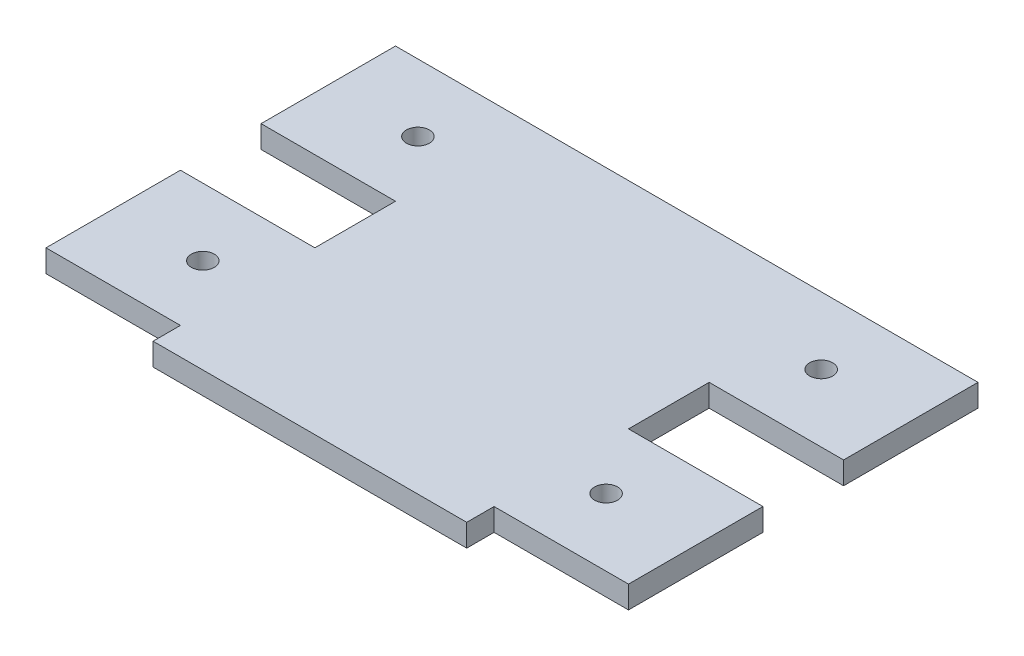
ISO-10303-21;
HEADER;
FILE_DESCRIPTION(('STEP AP214'),'2;1');
FILE_NAME('part.step','',(''),(''),'','','');
FILE_SCHEMA(('AUTOMOTIVE_DESIGN { 1 0 10303 214 1 1 1 1 }'));
ENDSEC;
DATA;
#1=APPLICATION_CONTEXT('core data for automotive mechanical design processes');
#2=APPLICATION_PROTOCOL_DEFINITION('international standard','automotive_design',2000,#1);
#3=PRODUCT_CONTEXT('',#1,'mechanical');
#4=PRODUCT('Part','Part','',(#3));
#5=PRODUCT_RELATED_PRODUCT_CATEGORY('part','',(#4));
#6=PRODUCT_DEFINITION_FORMATION('','',#4);
#7=PRODUCT_DEFINITION_CONTEXT('part definition',#1,'design');
#8=PRODUCT_DEFINITION('design','',#6,#7);
#9=PRODUCT_DEFINITION_SHAPE('','',#8);
#10=(LENGTH_UNIT() NAMED_UNIT(*) SI_UNIT(.MILLI.,.METRE.));
#11=(NAMED_UNIT(*) PLANE_ANGLE_UNIT() SI_UNIT($,.RADIAN.));
#12=(NAMED_UNIT(*) SI_UNIT($,.STERADIAN.) SOLID_ANGLE_UNIT());
#13=UNCERTAINTY_MEASURE_WITH_UNIT(LENGTH_MEASURE(1.E-05),#10,'distance_accuracy_value','');
#14=(GEOMETRIC_REPRESENTATION_CONTEXT(3) GLOBAL_UNCERTAINTY_ASSIGNED_CONTEXT((#13)) GLOBAL_UNIT_ASSIGNED_CONTEXT((#10,
#11,#12)) REPRESENTATION_CONTEXT('',''));
#15=CARTESIAN_POINT('',(0.,0.,0.));
#16=DIRECTION('',(0.,0.,1.));
#17=DIRECTION('',(1.,0.,0.));
#18=AXIS2_PLACEMENT_3D('',#15,#16,#17);
#19=CARTESIAN_POINT('',(0.,0.,0.));
#20=DIRECTION('',(0.,-1.,0.));
#21=DIRECTION('',(0.,0.,-1.));
#22=AXIS2_PLACEMENT_3D('',#19,#20,#21);
#23=PLANE('',#22);
#24=DIRECTION('',(1.,0.,0.));
#25=VECTOR('',#24,1.);
#26=CARTESIAN_POINT('',(52.6846640756631,0.,-6.53682126909372));
#27=LINE('',#26,#25);
#28=CARTESIAN_POINT('',(0.,0.,-6.53682126909372));
#29=VERTEX_POINT('',#28);
#30=CARTESIAN_POINT('',(44.45,0.,-6.53682126909372));
#31=VERTEX_POINT('',#30);
#32=EDGE_CURVE('E324',#29,#31,#27,.T.);
#33=ORIENTED_EDGE('',*,*,#32,.F.);
#34=DIRECTION('',(0.,0.,1.));
#35=VECTOR('',#34,1.);
#36=CARTESIAN_POINT('',(0.,0.,0.));
#37=LINE('',#36,#35);
#38=CARTESIAN_POINT('',(0.,0.,-10.414));
#39=VERTEX_POINT('',#38);
#40=EDGE_CURVE('E176',#39,#29,#37,.T.);
#41=ORIENTED_EDGE('',*,*,#40,.F.);
#42=DIRECTION('',(1.,0.,0.));
#43=VECTOR('',#42,1.);
#44=CARTESIAN_POINT('',(-19.05,0.,-10.414));
#45=LINE('',#44,#43);
#46=CARTESIAN_POINT('',(-19.05,0.,-10.414));
#47=VERTEX_POINT('',#46);
#48=EDGE_CURVE('E107',#47,#39,#45,.T.);
#49=ORIENTED_EDGE('',*,*,#48,.F.);
#50=DIRECTION('',(0.,0.,1.));
#51=VECTOR('',#50,1.);
#52=CARTESIAN_POINT('',(-19.05,0.,-29.464));
#53=LINE('',#52,#51);
#54=CARTESIAN_POINT('',(-19.05,0.,-29.464));
#55=VERTEX_POINT('',#54);
#56=EDGE_CURVE('E204',#55,#47,#53,.T.);
#57=ORIENTED_EDGE('',*,*,#56,.F.);
#58=DIRECTION('',(-1.,0.,0.));
#59=VECTOR('',#58,1.);
#60=CARTESIAN_POINT('',(0.,0.,-29.464));
#61=LINE('',#60,#59);
#62=CARTESIAN_POINT('',(0.,0.,-29.464));
#63=VERTEX_POINT('',#62);
#64=EDGE_CURVE('E164',#63,#55,#61,.T.);
#65=ORIENTED_EDGE('',*,*,#64,.F.);
#66=DIRECTION('',(0.,0.,1.));
#67=VECTOR('',#66,1.);
#68=CARTESIAN_POINT('',(0.,0.,-29.464));
#69=LINE('',#68,#67);
#70=CARTESIAN_POINT('',(0.,0.,-40.894));
#71=VERTEX_POINT('',#70);
#72=EDGE_CURVE('E201',#71,#63,#69,.T.);
#73=ORIENTED_EDGE('',*,*,#72,.F.);
#74=DIRECTION('',(1.,0.,0.));
#75=VECTOR('',#74,1.);
#76=CARTESIAN_POINT('',(0.,0.,-40.894));
#77=LINE('',#76,#75);
#78=CARTESIAN_POINT('',(-19.05,0.,-40.894));
#79=VERTEX_POINT('',#78);
#80=EDGE_CURVE('E199',#79,#71,#77,.T.);
#81=ORIENTED_EDGE('',*,*,#80,.F.);
#82=DIRECTION('',(0.,0.,1.));
#83=VECTOR('',#82,1.);
#84=CARTESIAN_POINT('',(-19.05,0.,-40.894));
#85=LINE('',#84,#83);
#86=CARTESIAN_POINT('',(-19.05,0.,-59.944));
#87=VERTEX_POINT('',#86);
#88=EDGE_CURVE('E197',#87,#79,#85,.T.);
#89=ORIENTED_EDGE('',*,*,#88,.F.);
#90=DIRECTION('',(-1.,0.,0.));
#91=VECTOR('',#90,1.);
#92=CARTESIAN_POINT('',(-19.05,0.,-59.944));
#93=LINE('',#92,#91);
#94=CARTESIAN_POINT('',(63.5000000000001,0.,-59.944));
#95=VERTEX_POINT('',#94);
#96=EDGE_CURVE('E195',#95,#87,#93,.T.);
#97=ORIENTED_EDGE('',*,*,#96,.F.);
#98=DIRECTION('',(0.,0.,-1.));
#99=VECTOR('',#98,1.);
#100=CARTESIAN_POINT('',(63.5000000000001,0.,-59.944));
#101=LINE('',#100,#99);
#102=CARTESIAN_POINT('',(63.5,0.,-40.894));
#103=VERTEX_POINT('',#102);
#104=EDGE_CURVE('E192',#103,#95,#101,.T.);
#105=ORIENTED_EDGE('',*,*,#104,.F.);
#106=DIRECTION('',(1.,0.,0.));
#107=VECTOR('',#106,1.);
#108=CARTESIAN_POINT('',(63.5,0.,-40.894));
#109=LINE('',#108,#107);
#110=CARTESIAN_POINT('',(44.4500000000001,0.,-40.894));
#111=VERTEX_POINT('',#110);
#112=EDGE_CURVE('E190',#111,#103,#109,.T.);
#113=ORIENTED_EDGE('',*,*,#112,.F.);
#114=DIRECTION('',(0.,0.,-1.));
#115=VECTOR('',#114,1.);
#116=CARTESIAN_POINT('',(44.4500000000001,0.,-40.894));
#117=LINE('',#116,#115);
#118=CARTESIAN_POINT('',(44.4500000000001,0.,-29.464));
#119=VERTEX_POINT('',#118);
#120=EDGE_CURVE('E188',#119,#111,#117,.T.);
#121=ORIENTED_EDGE('',*,*,#120,.F.);
#122=DIRECTION('',(-1.,0.,0.));
#123=VECTOR('',#122,1.);
#124=CARTESIAN_POINT('',(44.4500000000001,0.,-29.464));
#125=LINE('',#124,#123);
#126=CARTESIAN_POINT('',(63.5,0.,-29.464));
#127=VERTEX_POINT('',#126);
#128=EDGE_CURVE('E186',#127,#119,#125,.T.);
#129=ORIENTED_EDGE('',*,*,#128,.F.);
#130=DIRECTION('',(0.,0.,-1.));
#131=VECTOR('',#130,1.);
#132=CARTESIAN_POINT('',(63.5,0.,-29.464));
#133=LINE('',#132,#131);
#134=CARTESIAN_POINT('',(63.5,0.,-10.414));
#135=VERTEX_POINT('',#134);
#136=EDGE_CURVE('E184',#135,#127,#133,.T.);
#137=ORIENTED_EDGE('',*,*,#136,.F.);
#138=DIRECTION('',(1.,0.,0.));
#139=VECTOR('',#138,1.);
#140=CARTESIAN_POINT('',(63.5,0.,-10.414));
#141=LINE('',#140,#139);
#142=CARTESIAN_POINT('',(44.4500000000001,0.,-10.414));
#143=VERTEX_POINT('',#142);
#144=EDGE_CURVE('E182',#143,#135,#141,.T.);
#145=ORIENTED_EDGE('',*,*,#144,.F.);
#146=DIRECTION('',(0.,0.,-1.));
#147=VECTOR('',#146,1.);
#148=CARTESIAN_POINT('',(44.45,0.,0.));
#149=LINE('',#148,#147);
#150=EDGE_CURVE('E179',#31,#143,#149,.T.);
#151=ORIENTED_EDGE('',*,*,#150,.F.);
#152=EDGE_LOOP('',(#33,#41,#49,#57,#65,#73,#81,#89,#97,#105,#113,#121,#129,#137,#145,#151));
#153=FACE_BOUND('',#152,.T.);
#154=CARTESIAN_POINT('',(-6.35,0.,-50.4189999999999));
#155=DIRECTION('',(0.,1.,0.));
#156=DIRECTION('',(0.,0.,1.));
#157=AXIS2_PLACEMENT_3D('',#154,#155,#156);
#158=CIRCLE('',#157,1.63195);
#159=CARTESIAN_POINT('',(-6.35,0.,-48.78705));
#160=VERTEX_POINT('',#159);
#161=EDGE_CURVE('E316',#160,#160,#158,.T.);
#162=ORIENTED_EDGE('',*,*,#161,.T.);
#163=EDGE_LOOP('',(#162));
#164=FACE_BOUND('',#163,.T.);
#165=CARTESIAN_POINT('',(50.8000000000001,0.,-50.419));
#166=DIRECTION('',(0.,1.,0.));
#167=DIRECTION('',(0.,0.,1.));
#168=AXIS2_PLACEMENT_3D('',#165,#166,#167);
#169=CIRCLE('',#168,1.63195);
#170=CARTESIAN_POINT('',(50.8000000000001,0.,-48.78705));
#171=VERTEX_POINT('',#170);
#172=EDGE_CURVE('E310',#171,#171,#169,.T.);
#173=ORIENTED_EDGE('',*,*,#172,.T.);
#174=EDGE_LOOP('',(#173));
#175=FACE_BOUND('',#174,.T.);
#176=CARTESIAN_POINT('',(50.8,0.,-19.939));
#177=DIRECTION('',(0.,1.,0.));
#178=DIRECTION('',(0.,0.,1.));
#179=AXIS2_PLACEMENT_3D('',#176,#177,#178);
#180=CIRCLE('',#179,1.63195);
#181=CARTESIAN_POINT('',(50.8,0.,-18.30705));
#182=VERTEX_POINT('',#181);
#183=EDGE_CURVE('E304',#182,#182,#180,.T.);
#184=ORIENTED_EDGE('',*,*,#183,.T.);
#185=EDGE_LOOP('',(#184));
#186=FACE_BOUND('',#185,.T.);
#187=CARTESIAN_POINT('',(-6.35,0.,-19.939));
#188=DIRECTION('',(0.,1.,0.));
#189=DIRECTION('',(0.,0.,1.));
#190=AXIS2_PLACEMENT_3D('',#187,#188,#189);
#191=CIRCLE('',#190,1.63195);
#192=CARTESIAN_POINT('',(-6.35,0.,-18.30705));
#193=VERTEX_POINT('',#192);
#194=EDGE_CURVE('E180',#193,#193,#191,.T.);
#195=ORIENTED_EDGE('',*,*,#194,.T.);
#196=EDGE_LOOP('',(#195));
#197=FACE_BOUND('',#196,.T.);
#198=ADVANCED_FACE('F33',(#153,#164,#175,#186,#197),#23,.T.);
#199=CARTESIAN_POINT('',(0.,3.175,0.));
#200=DIRECTION('',(1.,0.,0.));
#201=DIRECTION('',(0.,0.,-1.));
#202=AXIS2_PLACEMENT_3D('',#199,#200,#201);
#203=PLANE('',#202);
#204=ORIENTED_EDGE('',*,*,#40,.T.);
#205=DIRECTION('',(0.,1.,0.));
#206=VECTOR('',#205,1.);
#207=CARTESIAN_POINT('',(0.,3.175,-6.53682126909372));
#208=LINE('',#207,#206);
#209=CARTESIAN_POINT('',(0.,3.175,-6.53682126909372));
#210=VERTEX_POINT('',#209);
#211=EDGE_CURVE('E295',#29,#210,#208,.T.);
#212=ORIENTED_EDGE('',*,*,#211,.T.);
#213=DIRECTION('',(0.,0.,1.));
#214=VECTOR('',#213,1.);
#215=CARTESIAN_POINT('',(0.,3.175,0.));
#216=LINE('',#215,#214);
#217=CARTESIAN_POINT('',(0.,3.175,-10.414));
#218=VERTEX_POINT('',#217);
#219=EDGE_CURVE('E207',#218,#210,#216,.T.);
#220=ORIENTED_EDGE('',*,*,#219,.F.);
#221=DIRECTION('',(0.,-1.,0.));
#222=VECTOR('',#221,1.);
#223=CARTESIAN_POINT('',(0.,3.175,-10.414));
#224=LINE('',#223,#222);
#225=EDGE_CURVE('E172',#218,#39,#224,.T.);
#226=ORIENTED_EDGE('',*,*,#225,.T.);
#227=EDGE_LOOP('',(#204,#212,#220,#226));
#228=FACE_BOUND('',#227,.T.);
#229=ADVANCED_FACE('F35',(#228),#203,.F.);
#230=CARTESIAN_POINT('',(44.45,3.175,0.));
#231=DIRECTION('',(-1.,0.,0.));
#232=DIRECTION('',(0.,0.,1.));
#233=AXIS2_PLACEMENT_3D('',#230,#231,#232);
#234=PLANE('',#233);
#235=DIRECTION('',(0.,0.,-1.));
#236=VECTOR('',#235,1.);
#237=CARTESIAN_POINT('',(44.45,3.175,0.));
#238=LINE('',#237,#236);
#239=CARTESIAN_POINT('',(44.4500000000001,3.175,-6.53682126909372));
#240=VERTEX_POINT('',#239);
#241=CARTESIAN_POINT('',(44.4500000000001,3.175,-10.414));
#242=VERTEX_POINT('',#241);
#243=EDGE_CURVE('E114',#240,#242,#238,.T.);
#244=ORIENTED_EDGE('',*,*,#243,.F.);
#245=DIRECTION('',(0.,-1.,0.));
#246=VECTOR('',#245,1.);
#247=CARTESIAN_POINT('',(44.4500000000001,3.175,-6.53682126909372));
#248=LINE('',#247,#246);
#249=EDGE_CURVE('E48',#240,#31,#248,.T.);
#250=ORIENTED_EDGE('',*,*,#249,.T.);
#251=ORIENTED_EDGE('',*,*,#150,.T.);
#252=DIRECTION('',(0.,-1.,0.));
#253=VECTOR('',#252,1.);
#254=CARTESIAN_POINT('',(44.4500000000001,3.175,-10.414));
#255=LINE('',#254,#253);
#256=EDGE_CURVE('E41',#242,#143,#255,.T.);
#257=ORIENTED_EDGE('',*,*,#256,.F.);
#258=EDGE_LOOP('',(#244,#250,#251,#257));
#259=FACE_BOUND('',#258,.T.);
#260=ADVANCED_FACE('F327',(#259),#234,.F.);
#261=CARTESIAN_POINT('',(63.5,3.175,-10.414));
#262=DIRECTION('',(0.,0.,-1.));
#263=DIRECTION('',(-1.,0.,0.));
#264=AXIS2_PLACEMENT_3D('',#261,#262,#263);
#265=PLANE('',#264);
#266=ORIENTED_EDGE('',*,*,#144,.T.);
#267=DIRECTION('',(0.,-1.,0.));
#268=VECTOR('',#267,1.);
#269=CARTESIAN_POINT('',(63.5,3.175,-10.414));
#270=LINE('',#269,#268);
#271=CARTESIAN_POINT('',(63.5,3.175,-10.414));
#272=VERTEX_POINT('',#271);
#273=EDGE_CURVE('E235',#272,#135,#270,.T.);
#274=ORIENTED_EDGE('',*,*,#273,.F.);
#275=DIRECTION('',(1.,0.,0.));
#276=VECTOR('',#275,1.);
#277=CARTESIAN_POINT('',(63.5,3.175,-10.414));
#278=LINE('',#277,#276);
#279=EDGE_CURVE('E243',#242,#272,#278,.T.);
#280=ORIENTED_EDGE('',*,*,#279,.F.);
#281=ORIENTED_EDGE('',*,*,#256,.T.);
#282=EDGE_LOOP('',(#266,#274,#280,#281));
#283=FACE_BOUND('',#282,.T.);
#284=ADVANCED_FACE('F241',(#283),#265,.F.);
#285=CARTESIAN_POINT('',(63.5,3.175,-29.464));
#286=DIRECTION('',(-1.,0.,0.));
#287=DIRECTION('',(0.,0.,1.));
#288=AXIS2_PLACEMENT_3D('',#285,#286,#287);
#289=PLANE('',#288);
#290=ORIENTED_EDGE('',*,*,#136,.T.);
#291=DIRECTION('',(0.,-1.,0.));
#292=VECTOR('',#291,1.);
#293=CARTESIAN_POINT('',(63.5,3.175,-29.464));
#294=LINE('',#293,#292);
#295=CARTESIAN_POINT('',(63.5,3.175,-29.464));
#296=VERTEX_POINT('',#295);
#297=EDGE_CURVE('E232',#296,#127,#294,.T.);
#298=ORIENTED_EDGE('',*,*,#297,.F.);
#299=DIRECTION('',(0.,0.,-1.));
#300=VECTOR('',#299,1.);
#301=CARTESIAN_POINT('',(63.5,3.175,-29.464));
#302=LINE('',#301,#300);
#303=EDGE_CURVE('E264',#272,#296,#302,.T.);
#304=ORIENTED_EDGE('',*,*,#303,.F.);
#305=ORIENTED_EDGE('',*,*,#273,.T.);
#306=EDGE_LOOP('',(#290,#298,#304,#305));
#307=FACE_BOUND('',#306,.T.);
#308=ADVANCED_FACE('F255',(#307),#289,.F.);
#309=CARTESIAN_POINT('',(44.4500000000001,3.175,-29.464));
#310=DIRECTION('',(0.,0.,1.));
#311=DIRECTION('',(1.,0.,0.));
#312=AXIS2_PLACEMENT_3D('',#309,#310,#311);
#313=PLANE('',#312);
#314=ORIENTED_EDGE('',*,*,#128,.T.);
#315=DIRECTION('',(0.,-1.,0.));
#316=VECTOR('',#315,1.);
#317=CARTESIAN_POINT('',(44.4500000000001,3.175,-29.464));
#318=LINE('',#317,#316);
#319=CARTESIAN_POINT('',(44.4500000000001,3.175,-29.464));
#320=VERTEX_POINT('',#319);
#321=EDGE_CURVE('E229',#320,#119,#318,.T.);
#322=ORIENTED_EDGE('',*,*,#321,.F.);
#323=DIRECTION('',(-1.,0.,0.));
#324=VECTOR('',#323,1.);
#325=CARTESIAN_POINT('',(44.4500000000001,3.175,-29.464));
#326=LINE('',#325,#324);
#327=EDGE_CURVE('E261',#296,#320,#326,.T.);
#328=ORIENTED_EDGE('',*,*,#327,.F.);
#329=ORIENTED_EDGE('',*,*,#297,.T.);
#330=EDGE_LOOP('',(#314,#322,#328,#329));
#331=FACE_BOUND('',#330,.T.);
#332=ADVANCED_FACE('F259',(#331),#313,.F.);
#333=CARTESIAN_POINT('',(44.4500000000001,3.175,-40.894));
#334=DIRECTION('',(-1.,0.,0.));
#335=DIRECTION('',(0.,0.,1.));
#336=AXIS2_PLACEMENT_3D('',#333,#334,#335);
#337=PLANE('',#336);
#338=ORIENTED_EDGE('',*,*,#120,.T.);
#339=DIRECTION('',(0.,-1.,0.));
#340=VECTOR('',#339,1.);
#341=CARTESIAN_POINT('',(44.4500000000001,3.175,-40.894));
#342=LINE('',#341,#340);
#343=CARTESIAN_POINT('',(44.4500000000001,3.175,-40.894));
#344=VERTEX_POINT('',#343);
#345=EDGE_CURVE('E226',#344,#111,#342,.T.);
#346=ORIENTED_EDGE('',*,*,#345,.F.);
#347=DIRECTION('',(0.,0.,-1.));
#348=VECTOR('',#347,1.);
#349=CARTESIAN_POINT('',(44.4500000000001,3.175,-40.894));
#350=LINE('',#349,#348);
#351=EDGE_CURVE('E263',#320,#344,#350,.T.);
#352=ORIENTED_EDGE('',*,*,#351,.F.);
#353=ORIENTED_EDGE('',*,*,#321,.T.);
#354=EDGE_LOOP('',(#338,#346,#352,#353));
#355=FACE_BOUND('',#354,.T.);
#356=ADVANCED_FACE('F366',(#355),#337,.F.);
#357=CARTESIAN_POINT('',(63.5,3.175,-40.894));
#358=DIRECTION('',(0.,0.,-1.));
#359=DIRECTION('',(-1.,0.,0.));
#360=AXIS2_PLACEMENT_3D('',#357,#358,#359);
#361=PLANE('',#360);
#362=ORIENTED_EDGE('',*,*,#112,.T.);
#363=DIRECTION('',(0.,-1.,0.));
#364=VECTOR('',#363,1.);
#365=CARTESIAN_POINT('',(63.5,3.175,-40.894));
#366=LINE('',#365,#364);
#367=CARTESIAN_POINT('',(63.5,3.175,-40.894));
#368=VERTEX_POINT('',#367);
#369=EDGE_CURVE('E223',#368,#103,#366,.T.);
#370=ORIENTED_EDGE('',*,*,#369,.F.);
#371=DIRECTION('',(1.,0.,0.));
#372=VECTOR('',#371,1.);
#373=CARTESIAN_POINT('',(63.5,3.175,-40.894));
#374=LINE('',#373,#372);
#375=EDGE_CURVE('E266',#344,#368,#374,.T.);
#376=ORIENTED_EDGE('',*,*,#375,.F.);
#377=ORIENTED_EDGE('',*,*,#345,.T.);
#378=EDGE_LOOP('',(#362,#370,#376,#377));
#379=FACE_BOUND('',#378,.T.);
#380=ADVANCED_FACE('F362',(#379),#361,.F.);
#381=CARTESIAN_POINT('',(63.5000000000001,3.175,-59.944));
#382=DIRECTION('',(-1.,0.,0.));
#383=DIRECTION('',(0.,0.,1.));
#384=AXIS2_PLACEMENT_3D('',#381,#382,#383);
#385=PLANE('',#384);
#386=ORIENTED_EDGE('',*,*,#104,.T.);
#387=DIRECTION('',(0.,-1.,0.));
#388=VECTOR('',#387,1.);
#389=CARTESIAN_POINT('',(63.5000000000001,3.175,-59.944));
#390=LINE('',#389,#388);
#391=CARTESIAN_POINT('',(63.5000000000001,3.175,-59.944));
#392=VERTEX_POINT('',#391);
#393=EDGE_CURVE('E220',#392,#95,#390,.T.);
#394=ORIENTED_EDGE('',*,*,#393,.F.);
#395=DIRECTION('',(0.,0.,-1.));
#396=VECTOR('',#395,1.);
#397=CARTESIAN_POINT('',(63.5000000000001,3.175,-59.944));
#398=LINE('',#397,#396);
#399=EDGE_CURVE('E272',#368,#392,#398,.T.);
#400=ORIENTED_EDGE('',*,*,#399,.F.);
#401=ORIENTED_EDGE('',*,*,#369,.T.);
#402=EDGE_LOOP('',(#386,#394,#400,#401));
#403=FACE_BOUND('',#402,.T.);
#404=ADVANCED_FACE('F358',(#403),#385,.F.);
#405=CARTESIAN_POINT('',(-19.05,3.175,-59.944));
#406=DIRECTION('',(0.,0.,1.));
#407=DIRECTION('',(1.,0.,0.));
#408=AXIS2_PLACEMENT_3D('',#405,#406,#407);
#409=PLANE('',#408);
#410=DIRECTION('',(0.,-1.,0.));
#411=VECTOR('',#410,1.);
#412=CARTESIAN_POINT('',(-19.05,3.175,-59.944));
#413=LINE('',#412,#411);
#414=CARTESIAN_POINT('',(-19.05,3.175,-59.944));
#415=VERTEX_POINT('',#414);
#416=EDGE_CURVE('E217',#415,#87,#413,.T.);
#417=ORIENTED_EDGE('',*,*,#416,.F.);
#418=DIRECTION('',(-1.,0.,0.));
#419=VECTOR('',#418,1.);
#420=CARTESIAN_POINT('',(44.4500000000001,3.175,-59.944));
#421=LINE('',#420,#419);
#422=EDGE_CURVE('E274',#392,#415,#421,.T.);
#423=ORIENTED_EDGE('',*,*,#422,.F.);
#424=ORIENTED_EDGE('',*,*,#393,.T.);
#425=ORIENTED_EDGE('',*,*,#96,.T.);
#426=EDGE_LOOP('',(#417,#423,#424,#425));
#427=FACE_BOUND('',#426,.T.);
#428=ADVANCED_FACE('F354',(#427),#409,.F.);
#429=CARTESIAN_POINT('',(-19.05,3.175,-40.894));
#430=DIRECTION('',(1.,0.,0.));
#431=DIRECTION('',(0.,0.,-1.));
#432=AXIS2_PLACEMENT_3D('',#429,#430,#431);
#433=PLANE('',#432);
#434=ORIENTED_EDGE('',*,*,#88,.T.);
#435=DIRECTION('',(0.,-1.,0.));
#436=VECTOR('',#435,1.);
#437=CARTESIAN_POINT('',(-19.05,3.175,-40.894));
#438=LINE('',#437,#436);
#439=CARTESIAN_POINT('',(-19.05,3.175,-40.894));
#440=VERTEX_POINT('',#439);
#441=EDGE_CURVE('E214',#440,#79,#438,.T.);
#442=ORIENTED_EDGE('',*,*,#441,.F.);
#443=DIRECTION('',(0.,0.,1.));
#444=VECTOR('',#443,1.);
#445=CARTESIAN_POINT('',(-19.05,3.175,-40.894));
#446=LINE('',#445,#444);
#447=EDGE_CURVE('E276',#415,#440,#446,.T.);
#448=ORIENTED_EDGE('',*,*,#447,.F.);
#449=ORIENTED_EDGE('',*,*,#416,.T.);
#450=EDGE_LOOP('',(#434,#442,#448,#449));
#451=FACE_BOUND('',#450,.T.);
#452=ADVANCED_FACE('F351',(#451),#433,.F.);
#453=CARTESIAN_POINT('',(0.,3.175,-40.894));
#454=DIRECTION('',(0.,0.,-1.));
#455=DIRECTION('',(-1.,0.,0.));
#456=AXIS2_PLACEMENT_3D('',#453,#454,#455);
#457=PLANE('',#456);
#458=ORIENTED_EDGE('',*,*,#80,.T.);
#459=DIRECTION('',(0.,-1.,0.));
#460=VECTOR('',#459,1.);
#461=CARTESIAN_POINT('',(0.,3.175,-40.894));
#462=LINE('',#461,#460);
#463=CARTESIAN_POINT('',(0.,3.175,-40.894));
#464=VERTEX_POINT('',#463);
#465=EDGE_CURVE('E211',#464,#71,#462,.T.);
#466=ORIENTED_EDGE('',*,*,#465,.F.);
#467=DIRECTION('',(1.,0.,0.));
#468=VECTOR('',#467,1.);
#469=CARTESIAN_POINT('',(0.,3.175,-40.894));
#470=LINE('',#469,#468);
#471=EDGE_CURVE('E278',#440,#464,#470,.T.);
#472=ORIENTED_EDGE('',*,*,#471,.F.);
#473=ORIENTED_EDGE('',*,*,#441,.T.);
#474=EDGE_LOOP('',(#458,#466,#472,#473));
#475=FACE_BOUND('',#474,.T.);
#476=ADVANCED_FACE('F284',(#475),#457,.F.);
#477=CARTESIAN_POINT('',(0.,3.175,-29.464));
#478=DIRECTION('',(1.,0.,0.));
#479=DIRECTION('',(0.,0.,-1.));
#480=AXIS2_PLACEMENT_3D('',#477,#478,#479);
#481=PLANE('',#480);
#482=ORIENTED_EDGE('',*,*,#72,.T.);
#483=DIRECTION('',(0.,-1.,0.));
#484=VECTOR('',#483,1.);
#485=CARTESIAN_POINT('',(0.,3.175,-29.464));
#486=LINE('',#485,#484);
#487=CARTESIAN_POINT('',(0.,3.175,-29.464));
#488=VERTEX_POINT('',#487);
#489=EDGE_CURVE('E167',#488,#63,#486,.T.);
#490=ORIENTED_EDGE('',*,*,#489,.F.);
#491=DIRECTION('',(0.,0.,1.));
#492=VECTOR('',#491,1.);
#493=CARTESIAN_POINT('',(0.,3.175,-29.464));
#494=LINE('',#493,#492);
#495=EDGE_CURVE('E155',#464,#488,#494,.T.);
#496=ORIENTED_EDGE('',*,*,#495,.F.);
#497=ORIENTED_EDGE('',*,*,#465,.T.);
#498=EDGE_LOOP('',(#482,#490,#496,#497));
#499=FACE_BOUND('',#498,.T.);
#500=ADVANCED_FACE('F288',(#499),#481,.F.);
#501=CARTESIAN_POINT('',(0.,3.175,-29.464));
#502=DIRECTION('',(0.,0.,1.));
#503=DIRECTION('',(1.,0.,0.));
#504=AXIS2_PLACEMENT_3D('',#501,#502,#503);
#505=PLANE('',#504);
#506=ORIENTED_EDGE('',*,*,#64,.T.);
#507=DIRECTION('',(0.,-1.,0.));
#508=VECTOR('',#507,1.);
#509=CARTESIAN_POINT('',(-19.05,3.175,-29.464));
#510=LINE('',#509,#508);
#511=CARTESIAN_POINT('',(-19.05,3.175,-29.464));
#512=VERTEX_POINT('',#511);
#513=EDGE_CURVE('E161',#512,#55,#510,.T.);
#514=ORIENTED_EDGE('',*,*,#513,.F.);
#515=DIRECTION('',(-1.,0.,0.));
#516=VECTOR('',#515,1.);
#517=CARTESIAN_POINT('',(0.,3.175,-29.464));
#518=LINE('',#517,#516);
#519=EDGE_CURVE('E148',#488,#512,#518,.T.);
#520=ORIENTED_EDGE('',*,*,#519,.F.);
#521=ORIENTED_EDGE('',*,*,#489,.T.);
#522=EDGE_LOOP('',(#506,#514,#520,#521));
#523=FACE_BOUND('',#522,.T.);
#524=ADVANCED_FACE('F162',(#523),#505,.F.);
#525=CARTESIAN_POINT('',(-19.05,3.175,-29.464));
#526=DIRECTION('',(1.,0.,0.));
#527=DIRECTION('',(0.,0.,-1.));
#528=AXIS2_PLACEMENT_3D('',#525,#526,#527);
#529=PLANE('',#528);
#530=ORIENTED_EDGE('',*,*,#56,.T.);
#531=DIRECTION('',(0.,-1.,0.));
#532=VECTOR('',#531,1.);
#533=CARTESIAN_POINT('',(-19.05,3.175,-10.414));
#534=LINE('',#533,#532);
#535=CARTESIAN_POINT('',(-19.05,3.175,-10.414));
#536=VERTEX_POINT('',#535);
#537=EDGE_CURVE('E168',#536,#47,#534,.T.);
#538=ORIENTED_EDGE('',*,*,#537,.F.);
#539=DIRECTION('',(0.,0.,1.));
#540=VECTOR('',#539,1.);
#541=CARTESIAN_POINT('',(-19.05,3.175,-29.464));
#542=LINE('',#541,#540);
#543=EDGE_CURVE('E152',#512,#536,#542,.T.);
#544=ORIENTED_EDGE('',*,*,#543,.F.);
#545=ORIENTED_EDGE('',*,*,#513,.T.);
#546=EDGE_LOOP('',(#530,#538,#544,#545));
#547=FACE_BOUND('',#546,.T.);
#548=ADVANCED_FACE('F170',(#547),#529,.F.);
#549=CARTESIAN_POINT('',(-19.05,3.175,-10.414));
#550=DIRECTION('',(0.,0.,-1.));
#551=DIRECTION('',(-1.,0.,0.));
#552=AXIS2_PLACEMENT_3D('',#549,#550,#551);
#553=PLANE('',#552);
#554=ORIENTED_EDGE('',*,*,#48,.T.);
#555=ORIENTED_EDGE('',*,*,#225,.F.);
#556=DIRECTION('',(1.,0.,0.));
#557=VECTOR('',#556,1.);
#558=CARTESIAN_POINT('',(-19.05,3.175,-10.414));
#559=LINE('',#558,#557);
#560=EDGE_CURVE('E56',#536,#218,#559,.T.);
#561=ORIENTED_EDGE('',*,*,#560,.F.);
#562=ORIENTED_EDGE('',*,*,#537,.T.);
#563=EDGE_LOOP('',(#554,#555,#561,#562));
#564=FACE_BOUND('',#563,.T.);
#565=ADVANCED_FACE('F290',(#564),#553,.F.);
#566=CARTESIAN_POINT('',(0.,3.175,0.));
#567=DIRECTION('',(0.,-1.,0.));
#568=DIRECTION('',(0.,0.,-1.));
#569=AXIS2_PLACEMENT_3D('',#566,#567,#568);
#570=PLANE('',#569);
#571=CARTESIAN_POINT('',(-6.35,3.175,-50.4189999999999));
#572=DIRECTION('',(0.,1.,0.));
#573=DIRECTION('',(0.,0.,1.));
#574=AXIS2_PLACEMENT_3D('',#571,#572,#573);
#575=CIRCLE('',#574,1.63195);
#576=CARTESIAN_POINT('',(-6.35,3.175,-48.78705));
#577=VERTEX_POINT('',#576);
#578=EDGE_CURVE('E319',#577,#577,#575,.T.);
#579=ORIENTED_EDGE('',*,*,#578,.F.);
#580=EDGE_LOOP('',(#579));
#581=FACE_BOUND('',#580,.T.);
#582=CARTESIAN_POINT('',(50.8000000000001,3.175,-50.419));
#583=DIRECTION('',(0.,1.,0.));
#584=DIRECTION('',(0.,0.,1.));
#585=AXIS2_PLACEMENT_3D('',#582,#583,#584);
#586=CIRCLE('',#585,1.63195);
#587=CARTESIAN_POINT('',(50.8000000000001,3.175,-48.78705));
#588=VERTEX_POINT('',#587);
#589=EDGE_CURVE('E313',#588,#588,#586,.T.);
#590=ORIENTED_EDGE('',*,*,#589,.F.);
#591=EDGE_LOOP('',(#590));
#592=FACE_BOUND('',#591,.T.);
#593=CARTESIAN_POINT('',(50.8,3.175,-19.939));
#594=DIRECTION('',(0.,1.,0.));
#595=DIRECTION('',(0.,0.,1.));
#596=AXIS2_PLACEMENT_3D('',#593,#594,#595);
#597=CIRCLE('',#596,1.63195);
#598=CARTESIAN_POINT('',(50.8,3.175,-18.30705));
#599=VERTEX_POINT('',#598);
#600=EDGE_CURVE('E307',#599,#599,#597,.T.);
#601=ORIENTED_EDGE('',*,*,#600,.F.);
#602=EDGE_LOOP('',(#601));
#603=FACE_BOUND('',#602,.T.);
#604=CARTESIAN_POINT('',(-6.35,3.175,-19.939));
#605=DIRECTION('',(0.,1.,0.));
#606=DIRECTION('',(0.,0.,1.));
#607=AXIS2_PLACEMENT_3D('',#604,#605,#606);
#608=CIRCLE('',#607,1.63195);
#609=CARTESIAN_POINT('',(-6.35,3.175,-18.30705));
#610=VERTEX_POINT('',#609);
#611=EDGE_CURVE('E301',#610,#610,#608,.T.);
#612=ORIENTED_EDGE('',*,*,#611,.F.);
#613=EDGE_LOOP('',(#612));
#614=FACE_BOUND('',#613,.T.);
#615=ORIENTED_EDGE('',*,*,#219,.T.);
#616=DIRECTION('',(1.,0.,0.));
#617=VECTOR('',#616,1.);
#618=CARTESIAN_POINT('',(0.,3.175,-6.53682126909372));
#619=LINE('',#618,#617);
#620=EDGE_CURVE('E11',#210,#240,#619,.T.);
#621=ORIENTED_EDGE('',*,*,#620,.T.);
#622=ORIENTED_EDGE('',*,*,#243,.T.);
#623=ORIENTED_EDGE('',*,*,#279,.T.);
#624=ORIENTED_EDGE('',*,*,#303,.T.);
#625=ORIENTED_EDGE('',*,*,#327,.T.);
#626=ORIENTED_EDGE('',*,*,#351,.T.);
#627=ORIENTED_EDGE('',*,*,#375,.T.);
#628=ORIENTED_EDGE('',*,*,#399,.T.);
#629=ORIENTED_EDGE('',*,*,#422,.T.);
#630=ORIENTED_EDGE('',*,*,#447,.T.);
#631=ORIENTED_EDGE('',*,*,#471,.T.);
#632=ORIENTED_EDGE('',*,*,#495,.T.);
#633=ORIENTED_EDGE('',*,*,#519,.T.);
#634=ORIENTED_EDGE('',*,*,#543,.T.);
#635=ORIENTED_EDGE('',*,*,#560,.T.);
#636=EDGE_LOOP('',(#615,#621,#622,#623,#624,#625,#626,#627,#628,#629,#630,#631,#632,#633,#634,#635));
#637=FACE_BOUND('',#636,.T.);
#638=ADVANCED_FACE('F150',(#581,#592,#603,#614,#637),#570,.F.);
#639=CARTESIAN_POINT('',(-6.35,3.175,-19.939));
#640=DIRECTION('',(0.,1.,0.));
#641=DIRECTION('',(0.,0.,1.));
#642=AXIS2_PLACEMENT_3D('',#639,#640,#641);
#643=CYLINDRICAL_SURFACE('',#642,1.63195);
#644=ORIENTED_EDGE('',*,*,#194,.F.);
#645=EDGE_LOOP('',(#644));
#646=FACE_BOUND('',#645,.T.);
#647=ORIENTED_EDGE('',*,*,#611,.T.);
#648=EDGE_LOOP('',(#647));
#649=FACE_BOUND('',#648,.T.);
#650=ADVANCED_FACE('F430',(#646,#649),#643,.F.);
#651=CARTESIAN_POINT('',(50.8,3.175,-19.939));
#652=DIRECTION('',(0.,1.,0.));
#653=DIRECTION('',(0.,0.,1.));
#654=AXIS2_PLACEMENT_3D('',#651,#652,#653);
#655=CYLINDRICAL_SURFACE('',#654,1.63195);
#656=ORIENTED_EDGE('',*,*,#183,.F.);
#657=EDGE_LOOP('',(#656));
#658=FACE_BOUND('',#657,.T.);
#659=ORIENTED_EDGE('',*,*,#600,.T.);
#660=EDGE_LOOP('',(#659));
#661=FACE_BOUND('',#660,.T.);
#662=ADVANCED_FACE('F437',(#658,#661),#655,.F.);
#663=CARTESIAN_POINT('',(50.8000000000001,3.175,-50.419));
#664=DIRECTION('',(0.,1.,0.));
#665=DIRECTION('',(0.,0.,1.));
#666=AXIS2_PLACEMENT_3D('',#663,#664,#665);
#667=CYLINDRICAL_SURFACE('',#666,1.63195);
#668=ORIENTED_EDGE('',*,*,#172,.F.);
#669=EDGE_LOOP('',(#668));
#670=FACE_BOUND('',#669,.T.);
#671=ORIENTED_EDGE('',*,*,#589,.T.);
#672=EDGE_LOOP('',(#671));
#673=FACE_BOUND('',#672,.T.);
#674=ADVANCED_FACE('F444',(#670,#673),#667,.F.);
#675=CARTESIAN_POINT('',(-6.35,3.175,-50.4189999999999));
#676=DIRECTION('',(0.,1.,0.));
#677=DIRECTION('',(0.,0.,1.));
#678=AXIS2_PLACEMENT_3D('',#675,#676,#677);
#679=CYLINDRICAL_SURFACE('',#678,1.63195);
#680=ORIENTED_EDGE('',*,*,#161,.F.);
#681=EDGE_LOOP('',(#680));
#682=FACE_BOUND('',#681,.T.);
#683=ORIENTED_EDGE('',*,*,#578,.T.);
#684=EDGE_LOOP('',(#683));
#685=FACE_BOUND('',#684,.T.);
#686=ADVANCED_FACE('F452',(#682,#685),#679,.F.);
#687=CARTESIAN_POINT('',(52.6846640756631,3.175,-6.53682126909372));
#688=DIRECTION('',(0.,0.,-1.));
#689=DIRECTION('',(-1.,0.,0.));
#690=AXIS2_PLACEMENT_3D('',#687,#688,#689);
#691=PLANE('',#690);
#692=ORIENTED_EDGE('',*,*,#32,.T.);
#693=ORIENTED_EDGE('',*,*,#249,.F.);
#694=ORIENTED_EDGE('',*,*,#620,.F.);
#695=ORIENTED_EDGE('',*,*,#211,.F.);
#696=EDGE_LOOP('',(#692,#693,#694,#695));
#697=FACE_BOUND('',#696,.T.);
#698=ADVANCED_FACE('F325',(#697),#691,.F.);
#699=CLOSED_SHELL('',(#198,#229,#260,#284,#308,#332,#356,#380,#404,#428,#452,#476,#500,#524,
#548,#565,#638,#650,#662,#674,#686,#698));
#700=MANIFOLD_SOLID_BREP('B2',#699);
#701=ADVANCED_BREP_SHAPE_REPRESENTATION('',(#18,#700),#14);
#702=SHAPE_DEFINITION_REPRESENTATION(#9,#701);
ENDSEC;
END-ISO-10303-21;
